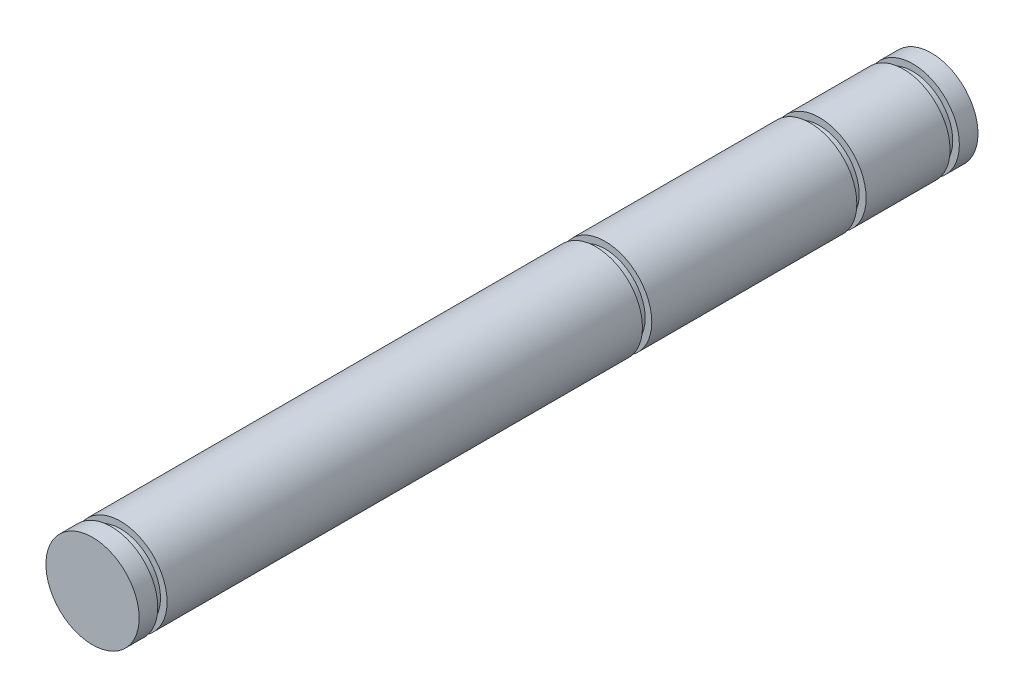
ISO-10303-21;
HEADER;
FILE_DESCRIPTION(('STEP AP214'),'2;1');
FILE_NAME('part.step','',(''),(''),'','','');
FILE_SCHEMA(('AUTOMOTIVE_DESIGN { 1 0 10303 214 1 1 1 1 }'));
ENDSEC;
DATA;
#1=APPLICATION_CONTEXT('core data for automotive mechanical design processes');
#2=APPLICATION_PROTOCOL_DEFINITION('international standard','automotive_design',2000,#1);
#3=PRODUCT_CONTEXT('',#1,'mechanical');
#4=PRODUCT('Part','Part','',(#3));
#5=PRODUCT_RELATED_PRODUCT_CATEGORY('part','',(#4));
#6=PRODUCT_DEFINITION_FORMATION('','',#4);
#7=PRODUCT_DEFINITION_CONTEXT('part definition',#1,'design');
#8=PRODUCT_DEFINITION('design','',#6,#7);
#9=PRODUCT_DEFINITION_SHAPE('','',#8);
#10=(LENGTH_UNIT() NAMED_UNIT(*) SI_UNIT(.MILLI.,.METRE.));
#11=(NAMED_UNIT(*) PLANE_ANGLE_UNIT() SI_UNIT($,.RADIAN.));
#12=(NAMED_UNIT(*) SI_UNIT($,.STERADIAN.) SOLID_ANGLE_UNIT());
#13=UNCERTAINTY_MEASURE_WITH_UNIT(LENGTH_MEASURE(1.E-05),#10,'distance_accuracy_value','');
#14=(GEOMETRIC_REPRESENTATION_CONTEXT(3) GLOBAL_UNCERTAINTY_ASSIGNED_CONTEXT((#13)) GLOBAL_UNIT_ASSIGNED_CONTEXT((#10,
#11,#12)) REPRESENTATION_CONTEXT('',''));
#15=CARTESIAN_POINT('',(0.,0.,0.));
#16=DIRECTION('',(0.,0.,1.));
#17=DIRECTION('',(1.,0.,0.));
#18=AXIS2_PLACEMENT_3D('',#15,#16,#17);
#19=CARTESIAN_POINT('',(0.,0.,7.31584543248999));
#20=DIRECTION('',(0.,0.,-1.));
#21=DIRECTION('',(-1.,0.,0.));
#22=AXIS2_PLACEMENT_3D('',#19,#20,#21);
#23=PLANE('',#22);
#24=CARTESIAN_POINT('',(0.,0.,7.31584543248999));
#25=DIRECTION('',(0.,0.,1.));
#26=DIRECTION('',(1.,0.,0.));
#27=AXIS2_PLACEMENT_3D('',#24,#25,#26);
#28=CIRCLE('',#27,5.);
#29=CARTESIAN_POINT('',(5.,0.,7.31584543248999));
#30=VERTEX_POINT('',#29);
#31=EDGE_CURVE('E12',#30,#30,#28,.T.);
#32=ORIENTED_EDGE('',*,*,#31,.T.);
#33=EDGE_LOOP('',(#32));
#34=FACE_BOUND('',#33,.T.);
#35=ADVANCED_FACE('F41',(#34),#23,.F.);
#36=CARTESIAN_POINT('',(0.,0.,7.31584543248999));
#37=DIRECTION('',(0.,0.,1.));
#38=DIRECTION('',(1.,0.,0.));
#39=AXIS2_PLACEMENT_3D('',#36,#37,#38);
#40=CYLINDRICAL_SURFACE('',#39,5.);
#41=ORIENTED_EDGE('',*,*,#31,.F.);
#42=EDGE_LOOP('',(#41));
#43=FACE_BOUND('',#42,.T.);
#44=CARTESIAN_POINT('',(0.,0.,5.31584543248999));
#45=DIRECTION('',(0.,0.,1.));
#46=DIRECTION('',(1.,0.,0.));
#47=AXIS2_PLACEMENT_3D('',#44,#45,#46);
#48=CIRCLE('',#47,5.);
#49=CARTESIAN_POINT('',(5.,0.,5.31584543248999));
#50=VERTEX_POINT('',#49);
#51=EDGE_CURVE('E47',#50,#50,#48,.T.);
#52=ORIENTED_EDGE('',*,*,#51,.T.);
#53=EDGE_LOOP('',(#52));
#54=FACE_BOUND('',#53,.T.);
#55=ADVANCED_FACE('F115',(#43,#54),#40,.T.);
#56=CARTESIAN_POINT('',(0.,5.,5.31584543248999));
#57=DIRECTION('',(0.,0.,1.));
#58=DIRECTION('',(1.,0.,0.));
#59=AXIS2_PLACEMENT_3D('',#56,#57,#58);
#60=PLANE('',#59);
#61=ORIENTED_EDGE('',*,*,#51,.F.);
#62=EDGE_LOOP('',(#61));
#63=FACE_BOUND('',#62,.T.);
#64=CARTESIAN_POINT('',(0.,0.,5.31584543248999));
#65=DIRECTION('',(0.,0.,1.));
#66=DIRECTION('',(1.,0.,0.));
#67=AXIS2_PLACEMENT_3D('',#64,#65,#66);
#68=CIRCLE('',#67,4.29203043210551);
#69=CARTESIAN_POINT('',(4.29203043210551,0.,5.31584543248999));
#70=VERTEX_POINT('',#69);
#71=EDGE_CURVE('E51',#70,#70,#68,.T.);
#72=ORIENTED_EDGE('',*,*,#71,.T.);
#73=EDGE_LOOP('',(#72));
#74=FACE_BOUND('',#73,.T.);
#75=ADVANCED_FACE('F119',(#63,#74),#60,.F.);
#76=CARTESIAN_POINT('',(0.,0.,7.31584543248999));
#77=DIRECTION('',(0.,0.,1.));
#78=DIRECTION('',(1.,0.,0.));
#79=AXIS2_PLACEMENT_3D('',#76,#77,#78);
#80=CYLINDRICAL_SURFACE('',#79,4.29203043210551);
#81=ORIENTED_EDGE('',*,*,#71,.F.);
#82=EDGE_LOOP('',(#81));
#83=FACE_BOUND('',#82,.T.);
#84=CARTESIAN_POINT('',(0.,0.,4.31584543248999));
#85=DIRECTION('',(0.,0.,1.));
#86=DIRECTION('',(1.,0.,0.));
#87=AXIS2_PLACEMENT_3D('',#84,#85,#86);
#88=CIRCLE('',#87,4.29203043210551);
#89=CARTESIAN_POINT('',(4.29203043210551,0.,4.31584543248999));
#90=VERTEX_POINT('',#89);
#91=EDGE_CURVE('E55',#90,#90,#88,.T.);
#92=ORIENTED_EDGE('',*,*,#91,.T.);
#93=EDGE_LOOP('',(#92));
#94=FACE_BOUND('',#93,.T.);
#95=ADVANCED_FACE('F124',(#83,#94),#80,.T.);
#96=CARTESIAN_POINT('',(0.,4.29203043210551,4.31584543248999));
#97=DIRECTION('',(0.,0.,-1.));
#98=DIRECTION('',(-1.,0.,0.));
#99=AXIS2_PLACEMENT_3D('',#96,#97,#98);
#100=PLANE('',#99);
#101=ORIENTED_EDGE('',*,*,#91,.F.);
#102=EDGE_LOOP('',(#101));
#103=FACE_BOUND('',#102,.T.);
#104=CARTESIAN_POINT('',(0.,0.,4.31584543248999));
#105=DIRECTION('',(0.,0.,1.));
#106=DIRECTION('',(1.,0.,0.));
#107=AXIS2_PLACEMENT_3D('',#104,#105,#106);
#108=CIRCLE('',#107,5.);
#109=CARTESIAN_POINT('',(5.,0.,4.31584543248999));
#110=VERTEX_POINT('',#109);
#111=EDGE_CURVE('E60',#110,#110,#108,.T.);
#112=ORIENTED_EDGE('',*,*,#111,.T.);
#113=EDGE_LOOP('',(#112));
#114=FACE_BOUND('',#113,.T.);
#115=ADVANCED_FACE('F130',(#103,#114),#100,.F.);
#116=CARTESIAN_POINT('',(0.,0.,7.31584543248999));
#117=DIRECTION('',(0.,0.,1.));
#118=DIRECTION('',(1.,0.,0.));
#119=AXIS2_PLACEMENT_3D('',#116,#117,#118);
#120=CYLINDRICAL_SURFACE('',#119,5.);
#121=ORIENTED_EDGE('',*,*,#111,.F.);
#122=EDGE_LOOP('',(#121));
#123=FACE_BOUND('',#122,.T.);
#124=CARTESIAN_POINT('',(0.,0.,-46.68415456751));
#125=DIRECTION('',(0.,0.,1.));
#126=DIRECTION('',(1.,0.,0.));
#127=AXIS2_PLACEMENT_3D('',#124,#125,#126);
#128=CIRCLE('',#127,5.);
#129=CARTESIAN_POINT('',(5.,0.,-46.68415456751));
#130=VERTEX_POINT('',#129);
#131=EDGE_CURVE('E63',#130,#130,#128,.T.);
#132=ORIENTED_EDGE('',*,*,#131,.T.);
#133=EDGE_LOOP('',(#132));
#134=FACE_BOUND('',#133,.T.);
#135=ADVANCED_FACE('F134',(#123,#134),#120,.T.);
#136=CARTESIAN_POINT('',(0.,5.,-46.68415456751));
#137=DIRECTION('',(0.,0.,1.));
#138=DIRECTION('',(1.,0.,0.));
#139=AXIS2_PLACEMENT_3D('',#136,#137,#138);
#140=PLANE('',#139);
#141=ORIENTED_EDGE('',*,*,#131,.F.);
#142=EDGE_LOOP('',(#141));
#143=FACE_BOUND('',#142,.T.);
#144=CARTESIAN_POINT('',(0.,0.,-46.68415456751));
#145=DIRECTION('',(0.,0.,1.));
#146=DIRECTION('',(1.,0.,0.));
#147=AXIS2_PLACEMENT_3D('',#144,#145,#146);
#148=CIRCLE('',#147,4.29203043210551);
#149=CARTESIAN_POINT('',(4.29203043210551,0.,-46.68415456751));
#150=VERTEX_POINT('',#149);
#151=EDGE_CURVE('E66',#150,#150,#148,.T.);
#152=ORIENTED_EDGE('',*,*,#151,.T.);
#153=EDGE_LOOP('',(#152));
#154=FACE_BOUND('',#153,.T.);
#155=ADVANCED_FACE('F138',(#143,#154),#140,.F.);
#156=CARTESIAN_POINT('',(0.,0.,7.31584543248999));
#157=DIRECTION('',(0.,0.,1.));
#158=DIRECTION('',(1.,0.,0.));
#159=AXIS2_PLACEMENT_3D('',#156,#157,#158);
#160=CYLINDRICAL_SURFACE('',#159,4.29203043210551);
#161=ORIENTED_EDGE('',*,*,#151,.F.);
#162=EDGE_LOOP('',(#161));
#163=FACE_BOUND('',#162,.T.);
#164=CARTESIAN_POINT('',(0.,0.,-47.68415456751));
#165=DIRECTION('',(0.,0.,1.));
#166=DIRECTION('',(1.,0.,0.));
#167=AXIS2_PLACEMENT_3D('',#164,#165,#166);
#168=CIRCLE('',#167,4.29203043210551);
#169=CARTESIAN_POINT('',(4.29203043210551,0.,-47.68415456751));
#170=VERTEX_POINT('',#169);
#171=EDGE_CURVE('E69',#170,#170,#168,.T.);
#172=ORIENTED_EDGE('',*,*,#171,.T.);
#173=EDGE_LOOP('',(#172));
#174=FACE_BOUND('',#173,.T.);
#175=ADVANCED_FACE('F142',(#163,#174),#160,.T.);
#176=CARTESIAN_POINT('',(0.,4.29203043210551,-47.68415456751));
#177=DIRECTION('',(0.,0.,-1.));
#178=DIRECTION('',(-1.,0.,0.));
#179=AXIS2_PLACEMENT_3D('',#176,#177,#178);
#180=PLANE('',#179);
#181=ORIENTED_EDGE('',*,*,#171,.F.);
#182=EDGE_LOOP('',(#181));
#183=FACE_BOUND('',#182,.T.);
#184=CARTESIAN_POINT('',(0.,0.,-47.68415456751));
#185=DIRECTION('',(0.,0.,1.));
#186=DIRECTION('',(1.,0.,0.));
#187=AXIS2_PLACEMENT_3D('',#184,#185,#186);
#188=CIRCLE('',#187,5.);
#189=CARTESIAN_POINT('',(5.,0.,-47.68415456751));
#190=VERTEX_POINT('',#189);
#191=EDGE_CURVE('E72',#190,#190,#188,.T.);
#192=ORIENTED_EDGE('',*,*,#191,.T.);
#193=EDGE_LOOP('',(#192));
#194=FACE_BOUND('',#193,.T.);
#195=ADVANCED_FACE('F146',(#183,#194),#180,.F.);
#196=CARTESIAN_POINT('',(0.,0.,7.31584543248999));
#197=DIRECTION('',(0.,0.,1.));
#198=DIRECTION('',(1.,0.,0.));
#199=AXIS2_PLACEMENT_3D('',#196,#197,#198);
#200=CYLINDRICAL_SURFACE('',#199,5.);
#201=ORIENTED_EDGE('',*,*,#191,.F.);
#202=EDGE_LOOP('',(#201));
#203=FACE_BOUND('',#202,.T.);
#204=CARTESIAN_POINT('',(0.,0.,-69.68415456751));
#205=DIRECTION('',(0.,0.,1.));
#206=DIRECTION('',(1.,0.,0.));
#207=AXIS2_PLACEMENT_3D('',#204,#205,#206);
#208=CIRCLE('',#207,5.);
#209=CARTESIAN_POINT('',(5.,0.,-69.68415456751));
#210=VERTEX_POINT('',#209);
#211=EDGE_CURVE('E75',#210,#210,#208,.T.);
#212=ORIENTED_EDGE('',*,*,#211,.T.);
#213=EDGE_LOOP('',(#212));
#214=FACE_BOUND('',#213,.T.);
#215=ADVANCED_FACE('F150',(#203,#214),#200,.T.);
#216=CARTESIAN_POINT('',(0.,5.,-69.68415456751));
#217=DIRECTION('',(0.,0.,1.));
#218=DIRECTION('',(1.,0.,0.));
#219=AXIS2_PLACEMENT_3D('',#216,#217,#218);
#220=PLANE('',#219);
#221=ORIENTED_EDGE('',*,*,#211,.F.);
#222=EDGE_LOOP('',(#221));
#223=FACE_BOUND('',#222,.T.);
#224=CARTESIAN_POINT('',(0.,0.,-69.68415456751));
#225=DIRECTION('',(0.,0.,1.));
#226=DIRECTION('',(1.,0.,0.));
#227=AXIS2_PLACEMENT_3D('',#224,#225,#226);
#228=CIRCLE('',#227,4.2558582788426);
#229=CARTESIAN_POINT('',(4.2558582788426,0.,-69.68415456751));
#230=VERTEX_POINT('',#229);
#231=EDGE_CURVE('E78',#230,#230,#228,.T.);
#232=ORIENTED_EDGE('',*,*,#231,.T.);
#233=EDGE_LOOP('',(#232));
#234=FACE_BOUND('',#233,.T.);
#235=ADVANCED_FACE('F154',(#223,#234),#220,.F.);
#236=CARTESIAN_POINT('',(0.,0.,7.31584543248999));
#237=DIRECTION('',(0.,0.,1.));
#238=DIRECTION('',(1.,0.,0.));
#239=AXIS2_PLACEMENT_3D('',#236,#237,#238);
#240=CYLINDRICAL_SURFACE('',#239,4.2558582788426);
#241=ORIENTED_EDGE('',*,*,#231,.F.);
#242=EDGE_LOOP('',(#241));
#243=FACE_BOUND('',#242,.T.);
#244=CARTESIAN_POINT('',(0.,0.,-70.68415456751));
#245=DIRECTION('',(0.,0.,1.));
#246=DIRECTION('',(1.,0.,0.));
#247=AXIS2_PLACEMENT_3D('',#244,#245,#246);
#248=CIRCLE('',#247,4.2558582788426);
#249=CARTESIAN_POINT('',(4.2558582788426,0.,-70.68415456751));
#250=VERTEX_POINT('',#249);
#251=EDGE_CURVE('E81',#250,#250,#248,.T.);
#252=ORIENTED_EDGE('',*,*,#251,.T.);
#253=EDGE_LOOP('',(#252));
#254=FACE_BOUND('',#253,.T.);
#255=ADVANCED_FACE('F158',(#243,#254),#240,.T.);
#256=CARTESIAN_POINT('',(0.,4.2558582788426,-70.68415456751));
#257=DIRECTION('',(0.,0.,-1.));
#258=DIRECTION('',(-1.,0.,0.));
#259=AXIS2_PLACEMENT_3D('',#256,#257,#258);
#260=PLANE('',#259);
#261=ORIENTED_EDGE('',*,*,#251,.F.);
#262=EDGE_LOOP('',(#261));
#263=FACE_BOUND('',#262,.T.);
#264=CARTESIAN_POINT('',(0.,0.,-70.68415456751));
#265=DIRECTION('',(0.,0.,1.));
#266=DIRECTION('',(1.,0.,0.));
#267=AXIS2_PLACEMENT_3D('',#264,#265,#266);
#268=CIRCLE('',#267,5.);
#269=CARTESIAN_POINT('',(5.,0.,-70.68415456751));
#270=VERTEX_POINT('',#269);
#271=EDGE_CURVE('E84',#270,#270,#268,.T.);
#272=ORIENTED_EDGE('',*,*,#271,.T.);
#273=EDGE_LOOP('',(#272));
#274=FACE_BOUND('',#273,.T.);
#275=ADVANCED_FACE('F162',(#263,#274),#260,.F.);
#276=CARTESIAN_POINT('',(0.,0.,7.31584543248999));
#277=DIRECTION('',(0.,0.,1.));
#278=DIRECTION('',(1.,0.,0.));
#279=AXIS2_PLACEMENT_3D('',#276,#277,#278);
#280=CYLINDRICAL_SURFACE('',#279,5.);
#281=ORIENTED_EDGE('',*,*,#271,.F.);
#282=EDGE_LOOP('',(#281));
#283=FACE_BOUND('',#282,.T.);
#284=CARTESIAN_POINT('',(0.,0.,-79.68415456751));
#285=DIRECTION('',(0.,0.,1.));
#286=DIRECTION('',(1.,0.,0.));
#287=AXIS2_PLACEMENT_3D('',#284,#285,#286);
#288=CIRCLE('',#287,5.);
#289=CARTESIAN_POINT('',(5.,0.,-79.68415456751));
#290=VERTEX_POINT('',#289);
#291=EDGE_CURVE('E87',#290,#290,#288,.T.);
#292=ORIENTED_EDGE('',*,*,#291,.T.);
#293=EDGE_LOOP('',(#292));
#294=FACE_BOUND('',#293,.T.);
#295=ADVANCED_FACE('F166',(#283,#294),#280,.T.);
#296=CARTESIAN_POINT('',(0.,5.,-79.68415456751));
#297=DIRECTION('',(0.,0.,1.));
#298=DIRECTION('',(1.,0.,0.));
#299=AXIS2_PLACEMENT_3D('',#296,#297,#298);
#300=PLANE('',#299);
#301=ORIENTED_EDGE('',*,*,#291,.F.);
#302=EDGE_LOOP('',(#301));
#303=FACE_BOUND('',#302,.T.);
#304=CARTESIAN_POINT('',(0.,0.,-79.68415456751));
#305=DIRECTION('',(0.,0.,1.));
#306=DIRECTION('',(1.,0.,0.));
#307=AXIS2_PLACEMENT_3D('',#304,#305,#306);
#308=CIRCLE('',#307,4.29203043210551);
#309=CARTESIAN_POINT('',(4.29203043210551,0.,-79.68415456751));
#310=VERTEX_POINT('',#309);
#311=EDGE_CURVE('E90',#310,#310,#308,.T.);
#312=ORIENTED_EDGE('',*,*,#311,.T.);
#313=EDGE_LOOP('',(#312));
#314=FACE_BOUND('',#313,.T.);
#315=ADVANCED_FACE('F170',(#303,#314),#300,.F.);
#316=CARTESIAN_POINT('',(0.,0.,7.31584543248999));
#317=DIRECTION('',(0.,0.,1.));
#318=DIRECTION('',(1.,0.,0.));
#319=AXIS2_PLACEMENT_3D('',#316,#317,#318);
#320=CYLINDRICAL_SURFACE('',#319,4.29203043210551);
#321=ORIENTED_EDGE('',*,*,#311,.F.);
#322=EDGE_LOOP('',(#321));
#323=FACE_BOUND('',#322,.T.);
#324=CARTESIAN_POINT('',(0.,0.,-80.68415456751));
#325=DIRECTION('',(0.,0.,1.));
#326=DIRECTION('',(1.,0.,0.));
#327=AXIS2_PLACEMENT_3D('',#324,#325,#326);
#328=CIRCLE('',#327,4.29203043210551);
#329=CARTESIAN_POINT('',(4.29203043210551,0.,-80.68415456751));
#330=VERTEX_POINT('',#329);
#331=EDGE_CURVE('E93',#330,#330,#328,.T.);
#332=ORIENTED_EDGE('',*,*,#331,.T.);
#333=EDGE_LOOP('',(#332));
#334=FACE_BOUND('',#333,.T.);
#335=ADVANCED_FACE('F174',(#323,#334),#320,.T.);
#336=CARTESIAN_POINT('',(0.,4.29203043210551,-80.68415456751));
#337=DIRECTION('',(0.,0.,-1.));
#338=DIRECTION('',(-1.,0.,0.));
#339=AXIS2_PLACEMENT_3D('',#336,#337,#338);
#340=PLANE('',#339);
#341=ORIENTED_EDGE('',*,*,#331,.F.);
#342=EDGE_LOOP('',(#341));
#343=FACE_BOUND('',#342,.T.);
#344=CARTESIAN_POINT('',(0.,0.,-80.68415456751));
#345=DIRECTION('',(0.,0.,1.));
#346=DIRECTION('',(1.,0.,0.));
#347=AXIS2_PLACEMENT_3D('',#344,#345,#346);
#348=CIRCLE('',#347,5.);
#349=CARTESIAN_POINT('',(5.,0.,-80.68415456751));
#350=VERTEX_POINT('',#349);
#351=EDGE_CURVE('E96',#350,#350,#348,.T.);
#352=ORIENTED_EDGE('',*,*,#351,.T.);
#353=EDGE_LOOP('',(#352));
#354=FACE_BOUND('',#353,.T.);
#355=ADVANCED_FACE('F111',(#343,#354),#340,.F.);
#356=CARTESIAN_POINT('',(0.,0.,7.31584543248999));
#357=DIRECTION('',(0.,0.,1.));
#358=DIRECTION('',(1.,0.,0.));
#359=AXIS2_PLACEMENT_3D('',#356,#357,#358);
#360=CYLINDRICAL_SURFACE('',#359,5.);
#361=ORIENTED_EDGE('',*,*,#351,.F.);
#362=EDGE_LOOP('',(#361));
#363=FACE_BOUND('',#362,.T.);
#364=CARTESIAN_POINT('',(0.,0.,-82.68415456751));
#365=DIRECTION('',(0.,0.,1.));
#366=DIRECTION('',(1.,0.,0.));
#367=AXIS2_PLACEMENT_3D('',#364,#365,#366);
#368=CIRCLE('',#367,5.);
#369=CARTESIAN_POINT('',(5.,0.,-82.68415456751));
#370=VERTEX_POINT('',#369);
#371=EDGE_CURVE('E99',#370,#370,#368,.T.);
#372=ORIENTED_EDGE('',*,*,#371,.T.);
#373=EDGE_LOOP('',(#372));
#374=FACE_BOUND('',#373,.T.);
#375=ADVANCED_FACE('F103',(#363,#374),#360,.T.);
#376=CARTESIAN_POINT('',(0.,5.,-82.68415456751));
#377=DIRECTION('',(0.,0.,1.));
#378=DIRECTION('',(1.,0.,0.));
#379=AXIS2_PLACEMENT_3D('',#376,#377,#378);
#380=PLANE('',#379);
#381=ORIENTED_EDGE('',*,*,#371,.F.);
#382=EDGE_LOOP('',(#381));
#383=FACE_BOUND('',#382,.T.);
#384=ADVANCED_FACE('F105',(#383),#380,.F.);
#385=CLOSED_SHELL('',(#35,#55,#75,#95,#115,#135,#155,#175,#195,#215,#235,#255,#275,#295,#315,
#335,#355,#375,#384));
#386=MANIFOLD_SOLID_BREP('B2',#385);
#387=ADVANCED_BREP_SHAPE_REPRESENTATION('',(#18,#386),#14);
#388=SHAPE_DEFINITION_REPRESENTATION(#9,#387);
ENDSEC;
END-ISO-10303-21;
